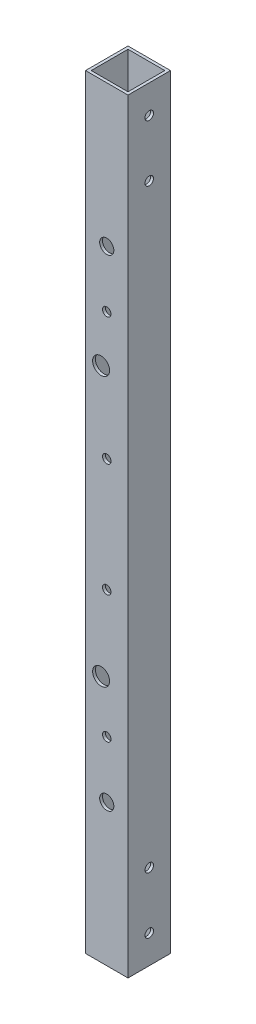
ISO-10303-21;
HEADER;
FILE_DESCRIPTION(('STEP AP214'),'2;1');
FILE_NAME('part.step','',(''),(''),'','','');
FILE_SCHEMA(('AUTOMOTIVE_DESIGN { 1 0 10303 214 1 1 1 1 }'));
ENDSEC;
DATA;
#1=APPLICATION_CONTEXT('core data for automotive mechanical design processes');
#2=APPLICATION_PROTOCOL_DEFINITION('international standard','automotive_design',2000,#1);
#3=PRODUCT_CONTEXT('',#1,'mechanical');
#4=PRODUCT('Part','Part','',(#3));
#5=PRODUCT_RELATED_PRODUCT_CATEGORY('part','',(#4));
#6=PRODUCT_DEFINITION_FORMATION('','',#4);
#7=PRODUCT_DEFINITION_CONTEXT('part definition',#1,'design');
#8=PRODUCT_DEFINITION('design','',#6,#7);
#9=PRODUCT_DEFINITION_SHAPE('','',#8);
#10=(LENGTH_UNIT() NAMED_UNIT(*) SI_UNIT(.MILLI.,.METRE.));
#11=(NAMED_UNIT(*) PLANE_ANGLE_UNIT() SI_UNIT($,.RADIAN.));
#12=(NAMED_UNIT(*) SI_UNIT($,.STERADIAN.) SOLID_ANGLE_UNIT());
#13=UNCERTAINTY_MEASURE_WITH_UNIT(LENGTH_MEASURE(1.E-05),#10,'distance_accuracy_value','');
#14=(GEOMETRIC_REPRESENTATION_CONTEXT(3) GLOBAL_UNCERTAINTY_ASSIGNED_CONTEXT((#13)) GLOBAL_UNIT_ASSIGNED_CONTEXT((#10,
#11,#12)) REPRESENTATION_CONTEXT('',''));
#15=CARTESIAN_POINT('',(0.,0.,0.));
#16=DIRECTION('',(0.,0.,1.));
#17=DIRECTION('',(1.,0.,0.));
#18=AXIS2_PLACEMENT_3D('',#15,#16,#17);
#19=CARTESIAN_POINT('',(0.,270.,0.));
#20=DIRECTION('',(0.,-1.,0.));
#21=DIRECTION('',(0.,0.,-1.));
#22=AXIS2_PLACEMENT_3D('',#19,#20,#21);
#23=PLANE('',#22);
#24=DIRECTION('',(0.,0.,-1.));
#25=VECTOR('',#24,1.);
#26=CARTESIAN_POINT('',(7.5,270.,7.5));
#27=LINE('',#26,#25);
#28=CARTESIAN_POINT('',(7.5,270.,7.5));
#29=VERTEX_POINT('',#28);
#30=CARTESIAN_POINT('',(7.5,270.,-7.5));
#31=VERTEX_POINT('',#30);
#32=EDGE_CURVE('E140',#29,#31,#27,.T.);
#33=ORIENTED_EDGE('',*,*,#32,.T.);
#34=DIRECTION('',(-1.,0.,0.));
#35=VECTOR('',#34,1.);
#36=CARTESIAN_POINT('',(-7.5,270.,-7.5));
#37=LINE('',#36,#35);
#38=CARTESIAN_POINT('',(-7.5,270.,-7.5));
#39=VERTEX_POINT('',#38);
#40=EDGE_CURVE('E143',#31,#39,#37,.T.);
#41=ORIENTED_EDGE('',*,*,#40,.T.);
#42=DIRECTION('',(0.,0.,1.));
#43=VECTOR('',#42,1.);
#44=CARTESIAN_POINT('',(-7.5,270.,7.5));
#45=LINE('',#44,#43);
#46=CARTESIAN_POINT('',(-7.5,270.,7.5));
#47=VERTEX_POINT('',#46);
#48=EDGE_CURVE('E146',#39,#47,#45,.T.);
#49=ORIENTED_EDGE('',*,*,#48,.T.);
#50=DIRECTION('',(1.,0.,0.));
#51=VECTOR('',#50,1.);
#52=CARTESIAN_POINT('',(-7.5,270.,7.5));
#53=LINE('',#52,#51);
#54=EDGE_CURVE('E148',#47,#29,#53,.T.);
#55=ORIENTED_EDGE('',*,*,#54,.T.);
#56=EDGE_LOOP('',(#33,#41,#49,#55));
#57=FACE_BOUND('',#56,.T.);
#58=DIRECTION('',(0.,0.,1.));
#59=VECTOR('',#58,1.);
#60=CARTESIAN_POINT('',(-6.5,270.,6.5));
#61=LINE('',#60,#59);
#62=CARTESIAN_POINT('',(-6.5,270.,-6.5));
#63=VERTEX_POINT('',#62);
#64=CARTESIAN_POINT('',(-6.5,270.,6.5));
#65=VERTEX_POINT('',#64);
#66=EDGE_CURVE('E102',#63,#65,#61,.T.);
#67=ORIENTED_EDGE('',*,*,#66,.F.);
#68=DIRECTION('',(-1.,0.,0.));
#69=VECTOR('',#68,1.);
#70=CARTESIAN_POINT('',(-6.5,270.,-6.5));
#71=LINE('',#70,#69);
#72=CARTESIAN_POINT('',(6.5,270.,-6.5));
#73=VERTEX_POINT('',#72);
#74=EDGE_CURVE('E124',#73,#63,#71,.T.);
#75=ORIENTED_EDGE('',*,*,#74,.F.);
#76=DIRECTION('',(0.,0.,-1.));
#77=VECTOR('',#76,1.);
#78=CARTESIAN_POINT('',(6.5,270.,6.5));
#79=LINE('',#78,#77);
#80=CARTESIAN_POINT('',(6.5,270.,6.5));
#81=VERTEX_POINT('',#80);
#82=EDGE_CURVE('E122',#81,#73,#79,.T.);
#83=ORIENTED_EDGE('',*,*,#82,.F.);
#84=DIRECTION('',(1.,0.,0.));
#85=VECTOR('',#84,1.);
#86=CARTESIAN_POINT('',(-6.5,270.,6.5));
#87=LINE('',#86,#85);
#88=EDGE_CURVE('E110',#65,#81,#87,.T.);
#89=ORIENTED_EDGE('',*,*,#88,.F.);
#90=EDGE_LOOP('',(#67,#75,#83,#89));
#91=FACE_BOUND('',#90,.T.);
#92=ADVANCED_FACE('F35',(#57,#91),#23,.F.);
#93=CARTESIAN_POINT('',(0.,0.,0.));
#94=DIRECTION('',(0.,-1.,0.));
#95=DIRECTION('',(0.,0.,-1.));
#96=AXIS2_PLACEMENT_3D('',#93,#94,#95);
#97=PLANE('',#96);
#98=DIRECTION('',(0.,0.,-1.));
#99=VECTOR('',#98,1.);
#100=CARTESIAN_POINT('',(7.5,0.,7.5));
#101=LINE('',#100,#99);
#102=CARTESIAN_POINT('',(7.5,0.,7.5));
#103=VERTEX_POINT('',#102);
#104=CARTESIAN_POINT('',(7.5,0.,-7.5));
#105=VERTEX_POINT('',#104);
#106=EDGE_CURVE('E118',#103,#105,#101,.T.);
#107=ORIENTED_EDGE('',*,*,#106,.F.);
#108=DIRECTION('',(1.,0.,0.));
#109=VECTOR('',#108,1.);
#110=CARTESIAN_POINT('',(-7.5,0.,7.5));
#111=LINE('',#110,#109);
#112=CARTESIAN_POINT('',(-7.5,0.,7.5));
#113=VERTEX_POINT('',#112);
#114=EDGE_CURVE('E144',#113,#103,#111,.T.);
#115=ORIENTED_EDGE('',*,*,#114,.F.);
#116=DIRECTION('',(0.,0.,1.));
#117=VECTOR('',#116,1.);
#118=CARTESIAN_POINT('',(-7.5,0.,7.5));
#119=LINE('',#118,#117);
#120=CARTESIAN_POINT('',(-7.5,0.,-7.5));
#121=VERTEX_POINT('',#120);
#122=EDGE_CURVE('E155',#121,#113,#119,.T.);
#123=ORIENTED_EDGE('',*,*,#122,.F.);
#124=DIRECTION('',(-1.,0.,0.));
#125=VECTOR('',#124,1.);
#126=CARTESIAN_POINT('',(-7.5,0.,-7.5));
#127=LINE('',#126,#125);
#128=EDGE_CURVE('E153',#105,#121,#127,.T.);
#129=ORIENTED_EDGE('',*,*,#128,.F.);
#130=EDGE_LOOP('',(#107,#115,#123,#129));
#131=FACE_BOUND('',#130,.T.);
#132=DIRECTION('',(-1.,0.,0.));
#133=VECTOR('',#132,1.);
#134=CARTESIAN_POINT('',(-6.5,0.,-6.5));
#135=LINE('',#134,#133);
#136=CARTESIAN_POINT('',(6.5,0.,-6.5));
#137=VERTEX_POINT('',#136);
#138=CARTESIAN_POINT('',(-6.5,0.,-6.5));
#139=VERTEX_POINT('',#138);
#140=EDGE_CURVE('E111',#137,#139,#135,.T.);
#141=ORIENTED_EDGE('',*,*,#140,.T.);
#142=DIRECTION('',(0.,0.,1.));
#143=VECTOR('',#142,1.);
#144=CARTESIAN_POINT('',(-6.5,0.,6.5));
#145=LINE('',#144,#143);
#146=CARTESIAN_POINT('',(-6.5,0.,6.5));
#147=VERTEX_POINT('',#146);
#148=EDGE_CURVE('E60',#139,#147,#145,.T.);
#149=ORIENTED_EDGE('',*,*,#148,.T.);
#150=DIRECTION('',(1.,0.,0.));
#151=VECTOR('',#150,1.);
#152=CARTESIAN_POINT('',(-6.5,0.,6.5));
#153=LINE('',#152,#151);
#154=CARTESIAN_POINT('',(6.5,0.,6.5));
#155=VERTEX_POINT('',#154);
#156=EDGE_CURVE('E117',#147,#155,#153,.T.);
#157=ORIENTED_EDGE('',*,*,#156,.T.);
#158=DIRECTION('',(0.,0.,-1.));
#159=VECTOR('',#158,1.);
#160=CARTESIAN_POINT('',(6.5,0.,6.5));
#161=LINE('',#160,#159);
#162=EDGE_CURVE('E132',#155,#137,#161,.T.);
#163=ORIENTED_EDGE('',*,*,#162,.T.);
#164=EDGE_LOOP('',(#141,#149,#157,#163));
#165=FACE_BOUND('',#164,.T.);
#166=ADVANCED_FACE('F314',(#131,#165),#97,.T.);
#167=CARTESIAN_POINT('',(7.5,270.,7.5));
#168=DIRECTION('',(-1.,0.,0.));
#169=DIRECTION('',(0.,0.,1.));
#170=AXIS2_PLACEMENT_3D('',#167,#168,#169);
#171=PLANE('',#170);
#172=CARTESIAN_POINT('',(7.5,260.,0.));
#173=DIRECTION('',(1.,0.,0.));
#174=DIRECTION('',(0.,0.,-1.));
#175=AXIS2_PLACEMENT_3D('',#172,#173,#174);
#176=CIRCLE('',#175,1.5);
#177=CARTESIAN_POINT('',(7.5,260.,-1.50000000000003));
#178=VERTEX_POINT('',#177);
#179=EDGE_CURVE('E457',#178,#178,#176,.T.);
#180=ORIENTED_EDGE('',*,*,#179,.F.);
#181=EDGE_LOOP('',(#180));
#182=FACE_BOUND('',#181,.T.);
#183=CARTESIAN_POINT('',(7.5,10.,0.));
#184=DIRECTION('',(1.,0.,0.));
#185=DIRECTION('',(0.,0.,-1.));
#186=AXIS2_PLACEMENT_3D('',#183,#184,#185);
#187=CIRCLE('',#186,1.5);
#188=CARTESIAN_POINT('',(7.5,10.,-1.50000000000003));
#189=VERTEX_POINT('',#188);
#190=EDGE_CURVE('E448',#189,#189,#187,.T.);
#191=ORIENTED_EDGE('',*,*,#190,.F.);
#192=EDGE_LOOP('',(#191));
#193=FACE_BOUND('',#192,.T.);
#194=CARTESIAN_POINT('',(7.5,30.,0.));
#195=DIRECTION('',(1.,0.,0.));
#196=DIRECTION('',(0.,0.,-1.));
#197=AXIS2_PLACEMENT_3D('',#194,#195,#196);
#198=CIRCLE('',#197,1.5);
#199=CARTESIAN_POINT('',(7.5,30.,-1.50000000000003));
#200=VERTEX_POINT('',#199);
#201=EDGE_CURVE('E219',#200,#200,#198,.T.);
#202=ORIENTED_EDGE('',*,*,#201,.F.);
#203=EDGE_LOOP('',(#202));
#204=FACE_BOUND('',#203,.T.);
#205=CARTESIAN_POINT('',(7.5,240.,0.));
#206=DIRECTION('',(1.,0.,0.));
#207=DIRECTION('',(0.,0.,-1.));
#208=AXIS2_PLACEMENT_3D('',#205,#206,#207);
#209=CIRCLE('',#208,1.5);
#210=CARTESIAN_POINT('',(7.5,240.,-1.50000000000003));
#211=VERTEX_POINT('',#210);
#212=EDGE_CURVE('E225',#211,#211,#209,.T.);
#213=ORIENTED_EDGE('',*,*,#212,.F.);
#214=EDGE_LOOP('',(#213));
#215=FACE_BOUND('',#214,.T.);
#216=ORIENTED_EDGE('',*,*,#106,.T.);
#217=DIRECTION('',(0.,-1.,0.));
#218=VECTOR('',#217,1.);
#219=CARTESIAN_POINT('',(7.5,270.,-7.5));
#220=LINE('',#219,#218);
#221=EDGE_CURVE('E11',#31,#105,#220,.T.);
#222=ORIENTED_EDGE('',*,*,#221,.F.);
#223=ORIENTED_EDGE('',*,*,#32,.F.);
#224=DIRECTION('',(0.,-1.,0.));
#225=VECTOR('',#224,1.);
#226=CARTESIAN_POINT('',(7.5,270.,7.5));
#227=LINE('',#226,#225);
#228=EDGE_CURVE('E150',#29,#103,#227,.T.);
#229=ORIENTED_EDGE('',*,*,#228,.T.);
#230=EDGE_LOOP('',(#216,#222,#223,#229));
#231=FACE_BOUND('',#230,.T.);
#232=ADVANCED_FACE('F37',(#182,#193,#204,#215,#231),#171,.F.);
#233=CARTESIAN_POINT('',(-7.5,270.,-7.5));
#234=DIRECTION('',(0.,0.,1.));
#235=DIRECTION('',(1.,0.,0.));
#236=AXIS2_PLACEMENT_3D('',#233,#234,#235);
#237=PLANE('',#236);
#238=CARTESIAN_POINT('',(0.,220.,-7.5));
#239=DIRECTION('',(0.,0.,1.));
#240=DIRECTION('',(1.,0.,0.));
#241=AXIS2_PLACEMENT_3D('',#238,#239,#240);
#242=CIRCLE('',#241,2.5);
#243=CARTESIAN_POINT('',(2.50000000000001,220.,-7.5));
#244=VERTEX_POINT('',#243);
#245=EDGE_CURVE('E245',#244,#244,#242,.T.);
#246=ORIENTED_EDGE('',*,*,#245,.T.);
#247=EDGE_LOOP('',(#246));
#248=FACE_BOUND('',#247,.T.);
#249=CARTESIAN_POINT('',(0.,50.,-7.5));
#250=DIRECTION('',(0.,0.,1.));
#251=DIRECTION('',(-1.,0.,0.));
#252=AXIS2_PLACEMENT_3D('',#249,#250,#251);
#253=CIRCLE('',#252,2.5);
#254=CARTESIAN_POINT('',(-2.5,50.,-7.5));
#255=VERTEX_POINT('',#254);
#256=EDGE_CURVE('E252',#255,#255,#253,.T.);
#257=ORIENTED_EDGE('',*,*,#256,.T.);
#258=EDGE_LOOP('',(#257));
#259=FACE_BOUND('',#258,.T.);
#260=CARTESIAN_POINT('',(-1.99999999999999,182.5,-7.5));
#261=DIRECTION('',(0.,0.,1.));
#262=DIRECTION('',(1.,0.,0.));
#263=AXIS2_PLACEMENT_3D('',#260,#261,#262);
#264=CIRCLE('',#263,3.);
#265=CARTESIAN_POINT('',(1.00000000000001,182.5,-7.5));
#266=VERTEX_POINT('',#265);
#267=EDGE_CURVE('E233',#266,#266,#264,.T.);
#268=ORIENTED_EDGE('',*,*,#267,.T.);
#269=EDGE_LOOP('',(#268));
#270=FACE_BOUND('',#269,.T.);
#271=CARTESIAN_POINT('',(-1.99999999999999,87.5,-7.5));
#272=DIRECTION('',(0.,0.,1.));
#273=DIRECTION('',(-1.,0.,0.));
#274=AXIS2_PLACEMENT_3D('',#271,#272,#273);
#275=CIRCLE('',#274,3.);
#276=CARTESIAN_POINT('',(-4.99999999999999,87.5,-7.5));
#277=VERTEX_POINT('',#276);
#278=EDGE_CURVE('E240',#277,#277,#275,.T.);
#279=ORIENTED_EDGE('',*,*,#278,.T.);
#280=EDGE_LOOP('',(#279));
#281=FACE_BOUND('',#280,.T.);
#282=CARTESIAN_POINT('',(0.,115.,-7.5));
#283=DIRECTION('',(0.,0.,1.));
#284=DIRECTION('',(1.,0.,0.));
#285=AXIS2_PLACEMENT_3D('',#282,#283,#284);
#286=CIRCLE('',#285,1.5);
#287=CARTESIAN_POINT('',(1.50000000000002,115.,-7.5));
#288=VERTEX_POINT('',#287);
#289=EDGE_CURVE('E173',#288,#288,#286,.T.);
#290=ORIENTED_EDGE('',*,*,#289,.T.);
#291=EDGE_LOOP('',(#290));
#292=FACE_BOUND('',#291,.T.);
#293=CARTESIAN_POINT('',(0.,200.,-7.5));
#294=DIRECTION('',(0.,0.,1.));
#295=DIRECTION('',(1.,0.,0.));
#296=AXIS2_PLACEMENT_3D('',#293,#294,#295);
#297=CIRCLE('',#296,1.5);
#298=CARTESIAN_POINT('',(1.50000000000001,200.,-7.5));
#299=VERTEX_POINT('',#298);
#300=EDGE_CURVE('E257',#299,#299,#297,.T.);
#301=ORIENTED_EDGE('',*,*,#300,.T.);
#302=EDGE_LOOP('',(#301));
#303=FACE_BOUND('',#302,.T.);
#304=CARTESIAN_POINT('',(0.,70.,-7.5));
#305=DIRECTION('',(0.,0.,1.));
#306=DIRECTION('',(1.,0.,0.));
#307=AXIS2_PLACEMENT_3D('',#304,#305,#306);
#308=CIRCLE('',#307,1.5);
#309=CARTESIAN_POINT('',(1.50000000000001,70.,-7.5));
#310=VERTEX_POINT('',#309);
#311=EDGE_CURVE('E264',#310,#310,#308,.T.);
#312=ORIENTED_EDGE('',*,*,#311,.T.);
#313=EDGE_LOOP('',(#312));
#314=FACE_BOUND('',#313,.T.);
#315=CARTESIAN_POINT('',(0.,155.,-7.5));
#316=DIRECTION('',(0.,0.,1.));
#317=DIRECTION('',(1.,0.,0.));
#318=AXIS2_PLACEMENT_3D('',#315,#316,#317);
#319=CIRCLE('',#318,1.5);
#320=CARTESIAN_POINT('',(1.50000000000002,155.,-7.5));
#321=VERTEX_POINT('',#320);
#322=EDGE_CURVE('E168',#321,#321,#319,.T.);
#323=ORIENTED_EDGE('',*,*,#322,.T.);
#324=EDGE_LOOP('',(#323));
#325=FACE_BOUND('',#324,.T.);
#326=ORIENTED_EDGE('',*,*,#128,.T.);
#327=DIRECTION('',(0.,-1.,0.));
#328=VECTOR('',#327,1.);
#329=CARTESIAN_POINT('',(-7.5,270.,-7.5));
#330=LINE('',#329,#328);
#331=EDGE_CURVE('E44',#39,#121,#330,.T.);
#332=ORIENTED_EDGE('',*,*,#331,.F.);
#333=ORIENTED_EDGE('',*,*,#40,.F.);
#334=ORIENTED_EDGE('',*,*,#221,.T.);
#335=EDGE_LOOP('',(#326,#332,#333,#334));
#336=FACE_BOUND('',#335,.T.);
#337=ADVANCED_FACE('F328',(#248,#259,#270,#281,#292,#303,#314,#325,#336),#237,.F.);
#338=CARTESIAN_POINT('',(-7.5,270.,7.5));
#339=DIRECTION('',(1.,0.,0.));
#340=DIRECTION('',(0.,0.,-1.));
#341=AXIS2_PLACEMENT_3D('',#338,#339,#340);
#342=PLANE('',#341);
#343=CARTESIAN_POINT('',(-7.5,260.,0.));
#344=DIRECTION('',(1.,0.,0.));
#345=DIRECTION('',(0.,0.,-1.));
#346=AXIS2_PLACEMENT_3D('',#343,#344,#345);
#347=CIRCLE('',#346,1.5);
#348=CARTESIAN_POINT('',(-7.5,260.,-1.50000000000003));
#349=VERTEX_POINT('',#348);
#350=EDGE_CURVE('E452',#349,#349,#347,.T.);
#351=ORIENTED_EDGE('',*,*,#350,.T.);
#352=EDGE_LOOP('',(#351));
#353=FACE_BOUND('',#352,.T.);
#354=CARTESIAN_POINT('',(-7.5,10.,0.));
#355=DIRECTION('',(1.,0.,0.));
#356=DIRECTION('',(0.,0.,-1.));
#357=AXIS2_PLACEMENT_3D('',#354,#355,#356);
#358=CIRCLE('',#357,1.5);
#359=CARTESIAN_POINT('',(-7.5,10.,-1.50000000000003));
#360=VERTEX_POINT('',#359);
#361=EDGE_CURVE('E446',#360,#360,#358,.T.);
#362=ORIENTED_EDGE('',*,*,#361,.T.);
#363=EDGE_LOOP('',(#362));
#364=FACE_BOUND('',#363,.T.);
#365=CARTESIAN_POINT('',(-7.5,30.,0.));
#366=DIRECTION('',(1.,0.,0.));
#367=DIRECTION('',(0.,0.,-1.));
#368=AXIS2_PLACEMENT_3D('',#365,#366,#367);
#369=CIRCLE('',#368,1.5);
#370=CARTESIAN_POINT('',(-7.5,30.,-1.50000000000003));
#371=VERTEX_POINT('',#370);
#372=EDGE_CURVE('E206',#371,#371,#369,.T.);
#373=ORIENTED_EDGE('',*,*,#372,.T.);
#374=EDGE_LOOP('',(#373));
#375=FACE_BOUND('',#374,.T.);
#376=CARTESIAN_POINT('',(-7.5,240.,0.));
#377=DIRECTION('',(1.,0.,0.));
#378=DIRECTION('',(0.,0.,-1.));
#379=AXIS2_PLACEMENT_3D('',#376,#377,#378);
#380=CIRCLE('',#379,1.5);
#381=CARTESIAN_POINT('',(-7.5,240.,-1.50000000000003));
#382=VERTEX_POINT('',#381);
#383=EDGE_CURVE('E202',#382,#382,#380,.T.);
#384=ORIENTED_EDGE('',*,*,#383,.T.);
#385=EDGE_LOOP('',(#384));
#386=FACE_BOUND('',#385,.T.);
#387=ORIENTED_EDGE('',*,*,#122,.T.);
#388=DIRECTION('',(0.,-1.,0.));
#389=VECTOR('',#388,1.);
#390=CARTESIAN_POINT('',(-7.5,270.,7.5));
#391=LINE('',#390,#389);
#392=EDGE_CURVE('E160',#47,#113,#391,.T.);
#393=ORIENTED_EDGE('',*,*,#392,.F.);
#394=ORIENTED_EDGE('',*,*,#48,.F.);
#395=ORIENTED_EDGE('',*,*,#331,.T.);
#396=EDGE_LOOP('',(#387,#393,#394,#395));
#397=FACE_BOUND('',#396,.T.);
#398=ADVANCED_FACE('F325',(#353,#364,#375,#386,#397),#342,.F.);
#399=CARTESIAN_POINT('',(-7.5,270.,7.5));
#400=DIRECTION('',(0.,0.,-1.));
#401=DIRECTION('',(-1.,0.,0.));
#402=AXIS2_PLACEMENT_3D('',#399,#400,#401);
#403=PLANE('',#402);
#404=CARTESIAN_POINT('',(0.,220.,7.5));
#405=DIRECTION('',(0.,0.,1.));
#406=DIRECTION('',(1.,0.,0.));
#407=AXIS2_PLACEMENT_3D('',#404,#405,#406);
#408=CIRCLE('',#407,2.5);
#409=CARTESIAN_POINT('',(2.50000000000001,220.,7.5));
#410=VERTEX_POINT('',#409);
#411=EDGE_CURVE('E249',#410,#410,#408,.T.);
#412=ORIENTED_EDGE('',*,*,#411,.F.);
#413=EDGE_LOOP('',(#412));
#414=FACE_BOUND('',#413,.T.);
#415=CARTESIAN_POINT('',(0.,50.,7.5));
#416=DIRECTION('',(0.,0.,1.));
#417=DIRECTION('',(-1.,0.,0.));
#418=AXIS2_PLACEMENT_3D('',#415,#416,#417);
#419=CIRCLE('',#418,2.5);
#420=CARTESIAN_POINT('',(-2.5,50.,7.5));
#421=VERTEX_POINT('',#420);
#422=EDGE_CURVE('E236',#421,#421,#419,.T.);
#423=ORIENTED_EDGE('',*,*,#422,.F.);
#424=EDGE_LOOP('',(#423));
#425=FACE_BOUND('',#424,.T.);
#426=CARTESIAN_POINT('',(-1.99999999999999,182.5,7.5));
#427=DIRECTION('',(0.,0.,1.));
#428=DIRECTION('',(1.,0.,0.));
#429=AXIS2_PLACEMENT_3D('',#426,#427,#428);
#430=CIRCLE('',#429,3.);
#431=CARTESIAN_POINT('',(1.00000000000001,182.5,7.5));
#432=VERTEX_POINT('',#431);
#433=EDGE_CURVE('E237',#432,#432,#430,.T.);
#434=ORIENTED_EDGE('',*,*,#433,.F.);
#435=EDGE_LOOP('',(#434));
#436=FACE_BOUND('',#435,.T.);
#437=CARTESIAN_POINT('',(-1.99999999999999,87.5,7.5));
#438=DIRECTION('',(0.,0.,1.));
#439=DIRECTION('',(-1.,0.,0.));
#440=AXIS2_PLACEMENT_3D('',#437,#438,#439);
#441=CIRCLE('',#440,3.);
#442=CARTESIAN_POINT('',(-4.99999999999999,87.5,7.5));
#443=VERTEX_POINT('',#442);
#444=EDGE_CURVE('E232',#443,#443,#441,.T.);
#445=ORIENTED_EDGE('',*,*,#444,.F.);
#446=EDGE_LOOP('',(#445));
#447=FACE_BOUND('',#446,.T.);
#448=CARTESIAN_POINT('',(0.,115.,7.5));
#449=DIRECTION('',(0.,0.,1.));
#450=DIRECTION('',(1.,0.,0.));
#451=AXIS2_PLACEMENT_3D('',#448,#449,#450);
#452=CIRCLE('',#451,1.5);
#453=CARTESIAN_POINT('',(1.50000000000002,115.,7.5));
#454=VERTEX_POINT('',#453);
#455=EDGE_CURVE('E260',#454,#454,#452,.T.);
#456=ORIENTED_EDGE('',*,*,#455,.F.);
#457=EDGE_LOOP('',(#456));
#458=FACE_BOUND('',#457,.T.);
#459=CARTESIAN_POINT('',(0.,200.,7.5));
#460=DIRECTION('',(0.,0.,1.));
#461=DIRECTION('',(1.,0.,0.));
#462=AXIS2_PLACEMENT_3D('',#459,#460,#461);
#463=CIRCLE('',#462,1.5);
#464=CARTESIAN_POINT('',(1.50000000000001,200.,7.5));
#465=VERTEX_POINT('',#464);
#466=EDGE_CURVE('E261',#465,#465,#463,.T.);
#467=ORIENTED_EDGE('',*,*,#466,.F.);
#468=EDGE_LOOP('',(#467));
#469=FACE_BOUND('',#468,.T.);
#470=CARTESIAN_POINT('',(0.,70.,7.5));
#471=DIRECTION('',(0.,0.,1.));
#472=DIRECTION('',(1.,0.,0.));
#473=AXIS2_PLACEMENT_3D('',#470,#471,#472);
#474=CIRCLE('',#473,1.5);
#475=CARTESIAN_POINT('',(1.50000000000001,70.,7.5));
#476=VERTEX_POINT('',#475);
#477=EDGE_CURVE('E248',#476,#476,#474,.T.);
#478=ORIENTED_EDGE('',*,*,#477,.F.);
#479=EDGE_LOOP('',(#478));
#480=FACE_BOUND('',#479,.T.);
#481=CARTESIAN_POINT('',(0.,155.,7.5));
#482=DIRECTION('',(0.,0.,1.));
#483=DIRECTION('',(1.,0.,0.));
#484=AXIS2_PLACEMENT_3D('',#481,#482,#483);
#485=CIRCLE('',#484,1.5);
#486=CARTESIAN_POINT('',(1.50000000000002,155.,7.5));
#487=VERTEX_POINT('',#486);
#488=EDGE_CURVE('E287',#487,#487,#485,.T.);
#489=ORIENTED_EDGE('',*,*,#488,.F.);
#490=EDGE_LOOP('',(#489));
#491=FACE_BOUND('',#490,.T.);
#492=ORIENTED_EDGE('',*,*,#114,.T.);
#493=ORIENTED_EDGE('',*,*,#228,.F.);
#494=ORIENTED_EDGE('',*,*,#54,.F.);
#495=ORIENTED_EDGE('',*,*,#392,.T.);
#496=EDGE_LOOP('',(#492,#493,#494,#495));
#497=FACE_BOUND('',#496,.T.);
#498=ADVANCED_FACE('F308',(#414,#425,#436,#447,#458,#469,#480,#491,#497),#403,.F.);
#499=CARTESIAN_POINT('',(-6.5,270.,6.5));
#500=DIRECTION('',(1.,0.,0.));
#501=DIRECTION('',(0.,0.,-1.));
#502=AXIS2_PLACEMENT_3D('',#499,#500,#501);
#503=PLANE('',#502);
#504=CARTESIAN_POINT('',(-6.5,260.,0.));
#505=DIRECTION('',(1.,0.,0.));
#506=DIRECTION('',(0.,0.,-1.));
#507=AXIS2_PLACEMENT_3D('',#504,#505,#506);
#508=CIRCLE('',#507,1.5);
#509=CARTESIAN_POINT('',(-6.5,260.,-1.50000000000003));
#510=VERTEX_POINT('',#509);
#511=EDGE_CURVE('E222',#510,#510,#508,.T.);
#512=ORIENTED_EDGE('',*,*,#511,.F.);
#513=EDGE_LOOP('',(#512));
#514=FACE_BOUND('',#513,.T.);
#515=CARTESIAN_POINT('',(-6.5,10.,0.));
#516=DIRECTION('',(1.,0.,0.));
#517=DIRECTION('',(0.,0.,-1.));
#518=AXIS2_PLACEMENT_3D('',#515,#516,#517);
#519=CIRCLE('',#518,1.5);
#520=CARTESIAN_POINT('',(-6.5,10.,-1.50000000000003));
#521=VERTEX_POINT('',#520);
#522=EDGE_CURVE('E209',#521,#521,#519,.T.);
#523=ORIENTED_EDGE('',*,*,#522,.F.);
#524=EDGE_LOOP('',(#523));
#525=FACE_BOUND('',#524,.T.);
#526=CARTESIAN_POINT('',(-6.5,30.,0.));
#527=DIRECTION('',(1.,0.,0.));
#528=DIRECTION('',(0.,0.,-1.));
#529=AXIS2_PLACEMENT_3D('',#526,#527,#528);
#530=CIRCLE('',#529,1.5);
#531=CARTESIAN_POINT('',(-6.5,30.,-1.50000000000003));
#532=VERTEX_POINT('',#531);
#533=EDGE_CURVE('E205',#532,#532,#530,.T.);
#534=ORIENTED_EDGE('',*,*,#533,.F.);
#535=EDGE_LOOP('',(#534));
#536=FACE_BOUND('',#535,.T.);
#537=CARTESIAN_POINT('',(-6.5,240.,0.));
#538=DIRECTION('',(1.,0.,0.));
#539=DIRECTION('',(0.,0.,-1.));
#540=AXIS2_PLACEMENT_3D('',#537,#538,#539);
#541=CIRCLE('',#540,1.5);
#542=CARTESIAN_POINT('',(-6.5,240.,-1.50000000000003));
#543=VERTEX_POINT('',#542);
#544=EDGE_CURVE('E201',#543,#543,#541,.T.);
#545=ORIENTED_EDGE('',*,*,#544,.F.);
#546=EDGE_LOOP('',(#545));
#547=FACE_BOUND('',#546,.T.);
#548=ORIENTED_EDGE('',*,*,#148,.F.);
#549=DIRECTION('',(0.,-1.,0.));
#550=VECTOR('',#549,1.);
#551=CARTESIAN_POINT('',(-6.5,270.,-6.5));
#552=LINE('',#551,#550);
#553=EDGE_CURVE('E106',#63,#139,#552,.T.);
#554=ORIENTED_EDGE('',*,*,#553,.F.);
#555=ORIENTED_EDGE('',*,*,#66,.T.);
#556=DIRECTION('',(0.,-1.,0.));
#557=VECTOR('',#556,1.);
#558=CARTESIAN_POINT('',(-6.5,270.,6.5));
#559=LINE('',#558,#557);
#560=EDGE_CURVE('E105',#65,#147,#559,.T.);
#561=ORIENTED_EDGE('',*,*,#560,.T.);
#562=EDGE_LOOP('',(#548,#554,#555,#561));
#563=FACE_BOUND('',#562,.T.);
#564=ADVANCED_FACE('F104',(#514,#525,#536,#547,#563),#503,.T.);
#565=CARTESIAN_POINT('',(-6.5,270.,6.5));
#566=DIRECTION('',(0.,0.,-1.));
#567=DIRECTION('',(-1.,0.,0.));
#568=AXIS2_PLACEMENT_3D('',#565,#566,#567);
#569=PLANE('',#568);
#570=CARTESIAN_POINT('',(0.,220.,6.5));
#571=DIRECTION('',(0.,0.,-1.));
#572=DIRECTION('',(-1.,0.,0.));
#573=AXIS2_PLACEMENT_3D('',#570,#571,#572);
#574=CIRCLE('',#573,2.5);
#575=CARTESIAN_POINT('',(-2.5,220.,6.5));
#576=VERTEX_POINT('',#575);
#577=EDGE_CURVE('E197',#576,#576,#574,.T.);
#578=ORIENTED_EDGE('',*,*,#577,.F.);
#579=EDGE_LOOP('',(#578));
#580=FACE_BOUND('',#579,.T.);
#581=CARTESIAN_POINT('',(0.,50.,6.5));
#582=DIRECTION('',(0.,0.,-1.));
#583=DIRECTION('',(-1.,0.,0.));
#584=AXIS2_PLACEMENT_3D('',#581,#582,#583);
#585=CIRCLE('',#584,2.5);
#586=CARTESIAN_POINT('',(-2.5,50.,6.5));
#587=VERTEX_POINT('',#586);
#588=EDGE_CURVE('E193',#587,#587,#585,.T.);
#589=ORIENTED_EDGE('',*,*,#588,.F.);
#590=EDGE_LOOP('',(#589));
#591=FACE_BOUND('',#590,.T.);
#592=CARTESIAN_POINT('',(-1.99999999999999,182.5,6.5));
#593=DIRECTION('',(0.,0.,-1.));
#594=DIRECTION('',(-1.,0.,0.));
#595=AXIS2_PLACEMENT_3D('',#592,#593,#594);
#596=CIRCLE('',#595,3.);
#597=CARTESIAN_POINT('',(-4.99999999999999,182.5,6.5));
#598=VERTEX_POINT('',#597);
#599=EDGE_CURVE('E189',#598,#598,#596,.T.);
#600=ORIENTED_EDGE('',*,*,#599,.F.);
#601=EDGE_LOOP('',(#600));
#602=FACE_BOUND('',#601,.T.);
#603=CARTESIAN_POINT('',(-1.99999999999999,87.5,6.5));
#604=DIRECTION('',(0.,0.,-1.));
#605=DIRECTION('',(-1.,0.,0.));
#606=AXIS2_PLACEMENT_3D('',#603,#604,#605);
#607=CIRCLE('',#606,3.);
#608=CARTESIAN_POINT('',(-4.99999999999999,87.5,6.5));
#609=VERTEX_POINT('',#608);
#610=EDGE_CURVE('E185',#609,#609,#607,.T.);
#611=ORIENTED_EDGE('',*,*,#610,.F.);
#612=EDGE_LOOP('',(#611));
#613=FACE_BOUND('',#612,.T.);
#614=CARTESIAN_POINT('',(0.,115.,6.5));
#615=DIRECTION('',(0.,0.,-1.));
#616=DIRECTION('',(-1.,0.,0.));
#617=AXIS2_PLACEMENT_3D('',#614,#615,#616);
#618=CIRCLE('',#617,1.5);
#619=CARTESIAN_POINT('',(-1.49999999999998,115.,6.5));
#620=VERTEX_POINT('',#619);
#621=EDGE_CURVE('E181',#620,#620,#618,.T.);
#622=ORIENTED_EDGE('',*,*,#621,.F.);
#623=EDGE_LOOP('',(#622));
#624=FACE_BOUND('',#623,.T.);
#625=CARTESIAN_POINT('',(0.,200.,6.5));
#626=DIRECTION('',(0.,0.,-1.));
#627=DIRECTION('',(-1.,0.,0.));
#628=AXIS2_PLACEMENT_3D('',#625,#626,#627);
#629=CIRCLE('',#628,1.5);
#630=CARTESIAN_POINT('',(-1.49999999999999,200.,6.5));
#631=VERTEX_POINT('',#630);
#632=EDGE_CURVE('E177',#631,#631,#629,.T.);
#633=ORIENTED_EDGE('',*,*,#632,.F.);
#634=EDGE_LOOP('',(#633));
#635=FACE_BOUND('',#634,.T.);
#636=CARTESIAN_POINT('',(0.,70.,6.5));
#637=DIRECTION('',(0.,0.,-1.));
#638=DIRECTION('',(-1.,0.,0.));
#639=AXIS2_PLACEMENT_3D('',#636,#637,#638);
#640=CIRCLE('',#639,1.5);
#641=CARTESIAN_POINT('',(-1.49999999999999,70.,6.5));
#642=VERTEX_POINT('',#641);
#643=EDGE_CURVE('E172',#642,#642,#640,.T.);
#644=ORIENTED_EDGE('',*,*,#643,.F.);
#645=EDGE_LOOP('',(#644));
#646=FACE_BOUND('',#645,.T.);
#647=CARTESIAN_POINT('',(0.,155.,6.5));
#648=DIRECTION('',(0.,0.,-1.));
#649=DIRECTION('',(-1.,0.,0.));
#650=AXIS2_PLACEMENT_3D('',#647,#648,#649);
#651=CIRCLE('',#650,1.5);
#652=CARTESIAN_POINT('',(-1.49999999999998,155.,6.5));
#653=VERTEX_POINT('',#652);
#654=EDGE_CURVE('E130',#653,#653,#651,.T.);
#655=ORIENTED_EDGE('',*,*,#654,.F.);
#656=EDGE_LOOP('',(#655));
#657=FACE_BOUND('',#656,.T.);
#658=ORIENTED_EDGE('',*,*,#156,.F.);
#659=ORIENTED_EDGE('',*,*,#560,.F.);
#660=ORIENTED_EDGE('',*,*,#88,.T.);
#661=DIRECTION('',(0.,-1.,0.));
#662=VECTOR('',#661,1.);
#663=CARTESIAN_POINT('',(6.5,270.,6.5));
#664=LINE('',#663,#662);
#665=EDGE_CURVE('E119',#81,#155,#664,.T.);
#666=ORIENTED_EDGE('',*,*,#665,.T.);
#667=EDGE_LOOP('',(#658,#659,#660,#666));
#668=FACE_BOUND('',#667,.T.);
#669=ADVANCED_FACE('F114',(#580,#591,#602,#613,#624,#635,#646,#657,#668),#569,.T.);
#670=CARTESIAN_POINT('',(6.5,270.,6.5));
#671=DIRECTION('',(-1.,0.,0.));
#672=DIRECTION('',(0.,0.,1.));
#673=AXIS2_PLACEMENT_3D('',#670,#671,#672);
#674=PLANE('',#673);
#675=CARTESIAN_POINT('',(6.5,260.,0.));
#676=DIRECTION('',(-1.,0.,0.));
#677=DIRECTION('',(0.,0.,1.));
#678=AXIS2_PLACEMENT_3D('',#675,#676,#677);
#679=CIRCLE('',#678,1.5);
#680=CARTESIAN_POINT('',(6.5,260.,1.49999999999997));
#681=VERTEX_POINT('',#680);
#682=EDGE_CURVE('E39',#681,#681,#679,.T.);
#683=ORIENTED_EDGE('',*,*,#682,.F.);
#684=EDGE_LOOP('',(#683));
#685=FACE_BOUND('',#684,.T.);
#686=CARTESIAN_POINT('',(6.5,10.,0.));
#687=DIRECTION('',(-1.,0.,0.));
#688=DIRECTION('',(0.,0.,1.));
#689=AXIS2_PLACEMENT_3D('',#686,#687,#688);
#690=CIRCLE('',#689,1.5);
#691=CARTESIAN_POINT('',(6.5,10.,1.49999999999997));
#692=VERTEX_POINT('',#691);
#693=EDGE_CURVE('E207',#692,#692,#690,.T.);
#694=ORIENTED_EDGE('',*,*,#693,.F.);
#695=EDGE_LOOP('',(#694));
#696=FACE_BOUND('',#695,.T.);
#697=CARTESIAN_POINT('',(6.5,30.,0.));
#698=DIRECTION('',(-1.,0.,0.));
#699=DIRECTION('',(0.,0.,1.));
#700=AXIS2_PLACEMENT_3D('',#697,#698,#699);
#701=CIRCLE('',#700,1.5);
#702=CARTESIAN_POINT('',(6.5,30.,1.49999999999997));
#703=VERTEX_POINT('',#702);
#704=EDGE_CURVE('E203',#703,#703,#701,.T.);
#705=ORIENTED_EDGE('',*,*,#704,.F.);
#706=EDGE_LOOP('',(#705));
#707=FACE_BOUND('',#706,.T.);
#708=CARTESIAN_POINT('',(6.5,240.,0.));
#709=DIRECTION('',(-1.,0.,0.));
#710=DIRECTION('',(0.,0.,1.));
#711=AXIS2_PLACEMENT_3D('',#708,#709,#710);
#712=CIRCLE('',#711,1.5);
#713=CARTESIAN_POINT('',(6.5,240.,1.49999999999997));
#714=VERTEX_POINT('',#713);
#715=EDGE_CURVE('E198',#714,#714,#712,.T.);
#716=ORIENTED_EDGE('',*,*,#715,.F.);
#717=EDGE_LOOP('',(#716));
#718=FACE_BOUND('',#717,.T.);
#719=ORIENTED_EDGE('',*,*,#162,.F.);
#720=ORIENTED_EDGE('',*,*,#665,.F.);
#721=ORIENTED_EDGE('',*,*,#82,.T.);
#722=DIRECTION('',(0.,-1.,0.));
#723=VECTOR('',#722,1.);
#724=CARTESIAN_POINT('',(6.5,270.,-6.5));
#725=LINE('',#724,#723);
#726=EDGE_CURVE('E52',#73,#137,#725,.T.);
#727=ORIENTED_EDGE('',*,*,#726,.T.);
#728=EDGE_LOOP('',(#719,#720,#721,#727));
#729=FACE_BOUND('',#728,.T.);
#730=ADVANCED_FACE('F298',(#685,#696,#707,#718,#729),#674,.T.);
#731=CARTESIAN_POINT('',(-6.5,270.,-6.5));
#732=DIRECTION('',(0.,0.,1.));
#733=DIRECTION('',(1.,0.,0.));
#734=AXIS2_PLACEMENT_3D('',#731,#732,#733);
#735=PLANE('',#734);
#736=CARTESIAN_POINT('',(0.,220.,-6.5));
#737=DIRECTION('',(0.,0.,1.));
#738=DIRECTION('',(1.,0.,0.));
#739=AXIS2_PLACEMENT_3D('',#736,#737,#738);
#740=CIRCLE('',#739,2.5);
#741=CARTESIAN_POINT('',(2.50000000000001,220.,-6.5));
#742=VERTEX_POINT('',#741);
#743=EDGE_CURVE('E194',#742,#742,#740,.T.);
#744=ORIENTED_EDGE('',*,*,#743,.F.);
#745=EDGE_LOOP('',(#744));
#746=FACE_BOUND('',#745,.T.);
#747=CARTESIAN_POINT('',(0.,50.,-6.5));
#748=DIRECTION('',(0.,0.,1.));
#749=DIRECTION('',(1.,0.,0.));
#750=AXIS2_PLACEMENT_3D('',#747,#748,#749);
#751=CIRCLE('',#750,2.5);
#752=CARTESIAN_POINT('',(2.50000000000001,50.,-6.5));
#753=VERTEX_POINT('',#752);
#754=EDGE_CURVE('E190',#753,#753,#751,.T.);
#755=ORIENTED_EDGE('',*,*,#754,.F.);
#756=EDGE_LOOP('',(#755));
#757=FACE_BOUND('',#756,.T.);
#758=CARTESIAN_POINT('',(-1.99999999999999,182.5,-6.5));
#759=DIRECTION('',(0.,0.,1.));
#760=DIRECTION('',(1.,0.,0.));
#761=AXIS2_PLACEMENT_3D('',#758,#759,#760);
#762=CIRCLE('',#761,3.);
#763=CARTESIAN_POINT('',(1.00000000000001,182.5,-6.5));
#764=VERTEX_POINT('',#763);
#765=EDGE_CURVE('E186',#764,#764,#762,.T.);
#766=ORIENTED_EDGE('',*,*,#765,.F.);
#767=EDGE_LOOP('',(#766));
#768=FACE_BOUND('',#767,.T.);
#769=CARTESIAN_POINT('',(-1.99999999999999,87.5,-6.5));
#770=DIRECTION('',(0.,0.,1.));
#771=DIRECTION('',(1.,0.,0.));
#772=AXIS2_PLACEMENT_3D('',#769,#770,#771);
#773=CIRCLE('',#772,3.);
#774=CARTESIAN_POINT('',(1.00000000000001,87.5,-6.5));
#775=VERTEX_POINT('',#774);
#776=EDGE_CURVE('E182',#775,#775,#773,.T.);
#777=ORIENTED_EDGE('',*,*,#776,.F.);
#778=EDGE_LOOP('',(#777));
#779=FACE_BOUND('',#778,.T.);
#780=CARTESIAN_POINT('',(0.,115.,-6.5));
#781=DIRECTION('',(0.,0.,1.));
#782=DIRECTION('',(1.,0.,0.));
#783=AXIS2_PLACEMENT_3D('',#780,#781,#782);
#784=CIRCLE('',#783,1.5);
#785=CARTESIAN_POINT('',(1.50000000000002,115.,-6.5));
#786=VERTEX_POINT('',#785);
#787=EDGE_CURVE('E178',#786,#786,#784,.T.);
#788=ORIENTED_EDGE('',*,*,#787,.F.);
#789=EDGE_LOOP('',(#788));
#790=FACE_BOUND('',#789,.T.);
#791=CARTESIAN_POINT('',(0.,200.,-6.5));
#792=DIRECTION('',(0.,0.,1.));
#793=DIRECTION('',(1.,0.,0.));
#794=AXIS2_PLACEMENT_3D('',#791,#792,#793);
#795=CIRCLE('',#794,1.5);
#796=CARTESIAN_POINT('',(1.50000000000001,200.,-6.5));
#797=VERTEX_POINT('',#796);
#798=EDGE_CURVE('E174',#797,#797,#795,.T.);
#799=ORIENTED_EDGE('',*,*,#798,.F.);
#800=EDGE_LOOP('',(#799));
#801=FACE_BOUND('',#800,.T.);
#802=CARTESIAN_POINT('',(0.,70.,-6.5));
#803=DIRECTION('',(0.,0.,1.));
#804=DIRECTION('',(1.,0.,0.));
#805=AXIS2_PLACEMENT_3D('',#802,#803,#804);
#806=CIRCLE('',#805,1.5);
#807=CARTESIAN_POINT('',(1.50000000000001,70.,-6.5));
#808=VERTEX_POINT('',#807);
#809=EDGE_CURVE('E169',#808,#808,#806,.T.);
#810=ORIENTED_EDGE('',*,*,#809,.F.);
#811=EDGE_LOOP('',(#810));
#812=FACE_BOUND('',#811,.T.);
#813=CARTESIAN_POINT('',(0.,155.,-6.5));
#814=DIRECTION('',(0.,0.,1.));
#815=DIRECTION('',(1.,0.,0.));
#816=AXIS2_PLACEMENT_3D('',#813,#814,#815);
#817=CIRCLE('',#816,1.5);
#818=CARTESIAN_POINT('',(1.50000000000002,155.,-6.5));
#819=VERTEX_POINT('',#818);
#820=EDGE_CURVE('E165',#819,#819,#817,.T.);
#821=ORIENTED_EDGE('',*,*,#820,.F.);
#822=EDGE_LOOP('',(#821));
#823=FACE_BOUND('',#822,.T.);
#824=ORIENTED_EDGE('',*,*,#140,.F.);
#825=ORIENTED_EDGE('',*,*,#726,.F.);
#826=ORIENTED_EDGE('',*,*,#74,.T.);
#827=ORIENTED_EDGE('',*,*,#553,.T.);
#828=EDGE_LOOP('',(#824,#825,#826,#827));
#829=FACE_BOUND('',#828,.T.);
#830=ADVANCED_FACE('F305',(#746,#757,#768,#779,#790,#801,#812,#823,#829),#735,.T.);
#831=CARTESIAN_POINT('',(0.,155.,-7.5));
#832=DIRECTION('',(0.,0.,1.));
#833=DIRECTION('',(1.,0.,0.));
#834=AXIS2_PLACEMENT_3D('',#831,#832,#833);
#835=CYLINDRICAL_SURFACE('',#834,1.5);
#836=ORIENTED_EDGE('',*,*,#820,.T.);
#837=EDGE_LOOP('',(#836));
#838=FACE_BOUND('',#837,.T.);
#839=ORIENTED_EDGE('',*,*,#322,.F.);
#840=EDGE_LOOP('',(#839));
#841=FACE_BOUND('',#840,.T.);
#842=ADVANCED_FACE('F368',(#838,#841),#835,.F.);
#843=ORIENTED_EDGE('',*,*,#654,.T.);
#844=EDGE_LOOP('',(#843));
#845=FACE_BOUND('',#844,.T.);
#846=ORIENTED_EDGE('',*,*,#488,.T.);
#847=EDGE_LOOP('',(#846));
#848=FACE_BOUND('',#847,.T.);
#849=ADVANCED_FACE('F294',(#845,#848),#835,.F.);
#850=CARTESIAN_POINT('',(0.,70.,-7.5));
#851=DIRECTION('',(0.,0.,1.));
#852=DIRECTION('',(1.,0.,0.));
#853=AXIS2_PLACEMENT_3D('',#850,#851,#852);
#854=CYLINDRICAL_SURFACE('',#853,1.5);
#855=ORIENTED_EDGE('',*,*,#809,.T.);
#856=EDGE_LOOP('',(#855));
#857=FACE_BOUND('',#856,.T.);
#858=ORIENTED_EDGE('',*,*,#311,.F.);
#859=EDGE_LOOP('',(#858));
#860=FACE_BOUND('',#859,.T.);
#861=ADVANCED_FACE('F386',(#857,#860),#854,.F.);
#862=CARTESIAN_POINT('',(0.,200.,-7.5));
#863=DIRECTION('',(0.,0.,1.));
#864=DIRECTION('',(1.,0.,0.));
#865=AXIS2_PLACEMENT_3D('',#862,#863,#864);
#866=CYLINDRICAL_SURFACE('',#865,1.5);
#867=ORIENTED_EDGE('',*,*,#798,.T.);
#868=EDGE_LOOP('',(#867));
#869=FACE_BOUND('',#868,.T.);
#870=ORIENTED_EDGE('',*,*,#300,.F.);
#871=EDGE_LOOP('',(#870));
#872=FACE_BOUND('',#871,.T.);
#873=ADVANCED_FACE('F383',(#869,#872),#866,.F.);
#874=CARTESIAN_POINT('',(0.,115.,-7.5));
#875=DIRECTION('',(0.,0.,1.));
#876=DIRECTION('',(1.,0.,0.));
#877=AXIS2_PLACEMENT_3D('',#874,#875,#876);
#878=CYLINDRICAL_SURFACE('',#877,1.5);
#879=ORIENTED_EDGE('',*,*,#787,.T.);
#880=EDGE_LOOP('',(#879));
#881=FACE_BOUND('',#880,.T.);
#882=ORIENTED_EDGE('',*,*,#289,.F.);
#883=EDGE_LOOP('',(#882));
#884=FACE_BOUND('',#883,.T.);
#885=ADVANCED_FACE('F379',(#881,#884),#878,.F.);
#886=CARTESIAN_POINT('',(-1.99999999999999,87.5,-7.5));
#887=DIRECTION('',(0.,0.,1.));
#888=DIRECTION('',(1.,0.,0.));
#889=AXIS2_PLACEMENT_3D('',#886,#887,#888);
#890=CYLINDRICAL_SURFACE('',#889,3.);
#891=ORIENTED_EDGE('',*,*,#776,.T.);
#892=EDGE_LOOP('',(#891));
#893=FACE_BOUND('',#892,.T.);
#894=ORIENTED_EDGE('',*,*,#278,.F.);
#895=EDGE_LOOP('',(#894));
#896=FACE_BOUND('',#895,.T.);
#897=ADVANCED_FACE('F382',(#893,#896),#890,.F.);
#898=CARTESIAN_POINT('',(-1.99999999999999,182.5,-7.5));
#899=DIRECTION('',(0.,0.,1.));
#900=DIRECTION('',(1.,0.,0.));
#901=AXIS2_PLACEMENT_3D('',#898,#899,#900);
#902=CYLINDRICAL_SURFACE('',#901,3.);
#903=ORIENTED_EDGE('',*,*,#765,.T.);
#904=EDGE_LOOP('',(#903));
#905=FACE_BOUND('',#904,.T.);
#906=ORIENTED_EDGE('',*,*,#267,.F.);
#907=EDGE_LOOP('',(#906));
#908=FACE_BOUND('',#907,.T.);
#909=ADVANCED_FACE('F399',(#905,#908),#902,.F.);
#910=CARTESIAN_POINT('',(0.,50.,-7.5));
#911=DIRECTION('',(0.,0.,1.));
#912=DIRECTION('',(1.,0.,0.));
#913=AXIS2_PLACEMENT_3D('',#910,#911,#912);
#914=CYLINDRICAL_SURFACE('',#913,2.5);
#915=ORIENTED_EDGE('',*,*,#754,.T.);
#916=EDGE_LOOP('',(#915));
#917=FACE_BOUND('',#916,.T.);
#918=ORIENTED_EDGE('',*,*,#256,.F.);
#919=EDGE_LOOP('',(#918));
#920=FACE_BOUND('',#919,.T.);
#921=ADVANCED_FACE('F395',(#917,#920),#914,.F.);
#922=CARTESIAN_POINT('',(0.,220.,-7.5));
#923=DIRECTION('',(0.,0.,1.));
#924=DIRECTION('',(1.,0.,0.));
#925=AXIS2_PLACEMENT_3D('',#922,#923,#924);
#926=CYLINDRICAL_SURFACE('',#925,2.5);
#927=ORIENTED_EDGE('',*,*,#743,.T.);
#928=EDGE_LOOP('',(#927));
#929=FACE_BOUND('',#928,.T.);
#930=ORIENTED_EDGE('',*,*,#245,.F.);
#931=EDGE_LOOP('',(#930));
#932=FACE_BOUND('',#931,.T.);
#933=ADVANCED_FACE('F398',(#929,#932),#926,.F.);
#934=ORIENTED_EDGE('',*,*,#643,.T.);
#935=EDGE_LOOP('',(#934));
#936=FACE_BOUND('',#935,.T.);
#937=ORIENTED_EDGE('',*,*,#477,.T.);
#938=EDGE_LOOP('',(#937));
#939=FACE_BOUND('',#938,.T.);
#940=ADVANCED_FACE('F390',(#936,#939),#854,.F.);
#941=ORIENTED_EDGE('',*,*,#632,.T.);
#942=EDGE_LOOP('',(#941));
#943=FACE_BOUND('',#942,.T.);
#944=ORIENTED_EDGE('',*,*,#466,.T.);
#945=EDGE_LOOP('',(#944));
#946=FACE_BOUND('',#945,.T.);
#947=ADVANCED_FACE('F394',(#943,#946),#866,.F.);
#948=ORIENTED_EDGE('',*,*,#621,.T.);
#949=EDGE_LOOP('',(#948));
#950=FACE_BOUND('',#949,.T.);
#951=ORIENTED_EDGE('',*,*,#455,.T.);
#952=EDGE_LOOP('',(#951));
#953=FACE_BOUND('',#952,.T.);
#954=ADVANCED_FACE('F385',(#950,#953),#878,.F.);
#955=ORIENTED_EDGE('',*,*,#610,.T.);
#956=EDGE_LOOP('',(#955));
#957=FACE_BOUND('',#956,.T.);
#958=ORIENTED_EDGE('',*,*,#444,.T.);
#959=EDGE_LOOP('',(#958));
#960=FACE_BOUND('',#959,.T.);
#961=ADVANCED_FACE('F409',(#957,#960),#890,.F.);
#962=ORIENTED_EDGE('',*,*,#599,.T.);
#963=EDGE_LOOP('',(#962));
#964=FACE_BOUND('',#963,.T.);
#965=ORIENTED_EDGE('',*,*,#433,.T.);
#966=EDGE_LOOP('',(#965));
#967=FACE_BOUND('',#966,.T.);
#968=ADVANCED_FACE('F413',(#964,#967),#902,.F.);
#969=ORIENTED_EDGE('',*,*,#588,.T.);
#970=EDGE_LOOP('',(#969));
#971=FACE_BOUND('',#970,.T.);
#972=ORIENTED_EDGE('',*,*,#422,.T.);
#973=EDGE_LOOP('',(#972));
#974=FACE_BOUND('',#973,.T.);
#975=ADVANCED_FACE('F401',(#971,#974),#914,.F.);
#976=ORIENTED_EDGE('',*,*,#577,.T.);
#977=EDGE_LOOP('',(#976));
#978=FACE_BOUND('',#977,.T.);
#979=ORIENTED_EDGE('',*,*,#411,.T.);
#980=EDGE_LOOP('',(#979));
#981=FACE_BOUND('',#980,.T.);
#982=ADVANCED_FACE('F405',(#978,#981),#926,.F.);
#983=CARTESIAN_POINT('',(-7.5,240.,0.));
#984=DIRECTION('',(1.,0.,0.));
#985=DIRECTION('',(0.,0.,-1.));
#986=AXIS2_PLACEMENT_3D('',#983,#984,#985);
#987=CYLINDRICAL_SURFACE('',#986,1.5);
#988=ORIENTED_EDGE('',*,*,#715,.T.);
#989=EDGE_LOOP('',(#988));
#990=FACE_BOUND('',#989,.T.);
#991=ORIENTED_EDGE('',*,*,#212,.T.);
#992=EDGE_LOOP('',(#991));
#993=FACE_BOUND('',#992,.T.);
#994=ADVANCED_FACE('F414',(#990,#993),#987,.F.);
#995=ORIENTED_EDGE('',*,*,#544,.T.);
#996=EDGE_LOOP('',(#995));
#997=FACE_BOUND('',#996,.T.);
#998=ORIENTED_EDGE('',*,*,#383,.F.);
#999=EDGE_LOOP('',(#998));
#1000=FACE_BOUND('',#999,.T.);
#1001=ADVANCED_FACE('F417',(#997,#1000),#987,.F.);
#1002=CARTESIAN_POINT('',(-7.5,30.,0.));
#1003=DIRECTION('',(1.,0.,0.));
#1004=DIRECTION('',(0.,0.,-1.));
#1005=AXIS2_PLACEMENT_3D('',#1002,#1003,#1004);
#1006=CYLINDRICAL_SURFACE('',#1005,1.5);
#1007=ORIENTED_EDGE('',*,*,#704,.T.);
#1008=EDGE_LOOP('',(#1007));
#1009=FACE_BOUND('',#1008,.T.);
#1010=ORIENTED_EDGE('',*,*,#201,.T.);
#1011=EDGE_LOOP('',(#1010));
#1012=FACE_BOUND('',#1011,.T.);
#1013=ADVANCED_FACE('F419',(#1009,#1012),#1006,.F.);
#1014=CARTESIAN_POINT('',(-7.5,10.,0.));
#1015=DIRECTION('',(1.,0.,0.));
#1016=DIRECTION('',(0.,0.,-1.));
#1017=AXIS2_PLACEMENT_3D('',#1014,#1015,#1016);
#1018=CYLINDRICAL_SURFACE('',#1017,1.5);
#1019=ORIENTED_EDGE('',*,*,#693,.T.);
#1020=EDGE_LOOP('',(#1019));
#1021=FACE_BOUND('',#1020,.T.);
#1022=ORIENTED_EDGE('',*,*,#190,.T.);
#1023=EDGE_LOOP('',(#1022));
#1024=FACE_BOUND('',#1023,.T.);
#1025=ADVANCED_FACE('F422',(#1021,#1024),#1018,.F.);
#1026=CARTESIAN_POINT('',(-7.5,260.,0.));
#1027=DIRECTION('',(1.,0.,0.));
#1028=DIRECTION('',(0.,0.,-1.));
#1029=AXIS2_PLACEMENT_3D('',#1026,#1027,#1028);
#1030=CYLINDRICAL_SURFACE('',#1029,1.5);
#1031=ORIENTED_EDGE('',*,*,#682,.T.);
#1032=EDGE_LOOP('',(#1031));
#1033=FACE_BOUND('',#1032,.T.);
#1034=ORIENTED_EDGE('',*,*,#179,.T.);
#1035=EDGE_LOOP('',(#1034));
#1036=FACE_BOUND('',#1035,.T.);
#1037=ADVANCED_FACE('F425',(#1033,#1036),#1030,.F.);
#1038=ORIENTED_EDGE('',*,*,#533,.T.);
#1039=EDGE_LOOP('',(#1038));
#1040=FACE_BOUND('',#1039,.T.);
#1041=ORIENTED_EDGE('',*,*,#372,.F.);
#1042=EDGE_LOOP('',(#1041));
#1043=FACE_BOUND('',#1042,.T.);
#1044=ADVANCED_FACE('F424',(#1040,#1043),#1006,.F.);
#1045=ORIENTED_EDGE('',*,*,#522,.T.);
#1046=EDGE_LOOP('',(#1045));
#1047=FACE_BOUND('',#1046,.T.);
#1048=ORIENTED_EDGE('',*,*,#361,.F.);
#1049=EDGE_LOOP('',(#1048));
#1050=FACE_BOUND('',#1049,.T.);
#1051=ADVANCED_FACE('F431',(#1047,#1050),#1018,.F.);
#1052=ORIENTED_EDGE('',*,*,#511,.T.);
#1053=EDGE_LOOP('',(#1052));
#1054=FACE_BOUND('',#1053,.T.);
#1055=ORIENTED_EDGE('',*,*,#350,.F.);
#1056=EDGE_LOOP('',(#1055));
#1057=FACE_BOUND('',#1056,.T.);
#1058=ADVANCED_FACE('F429',(#1054,#1057),#1030,.F.);
#1059=CLOSED_SHELL('',(#92,#166,#232,#337,#398,#498,#564,#669,#730,#830,#842,#849,#861,#873,
#885,#897,#909,#921,#933,#940,#947,#954,#961,#968,#975,#982,#994,#1001,#1013,#1025,#1037,#1044,
#1051,#1058));
#1060=MANIFOLD_SOLID_BREP('B2',#1059);
#1061=ADVANCED_BREP_SHAPE_REPRESENTATION('',(#18,#1060),#14);
#1062=SHAPE_DEFINITION_REPRESENTATION(#9,#1061);
ENDSEC;
END-ISO-10303-21;
